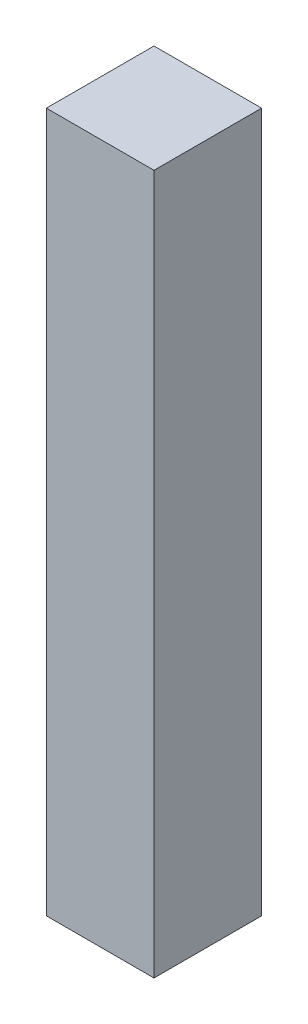
ISO-10303-21;
HEADER;
FILE_DESCRIPTION(('STEP AP214'),'2;1');
FILE_NAME('part.step','',(''),(''),'','','');
FILE_SCHEMA(('AUTOMOTIVE_DESIGN { 1 0 10303 214 1 1 1 1 }'));
ENDSEC;
DATA;
#1=APPLICATION_CONTEXT('core data for automotive mechanical design processes');
#2=APPLICATION_PROTOCOL_DEFINITION('international standard','automotive_design',2000,#1);
#3=PRODUCT_CONTEXT('',#1,'mechanical');
#4=PRODUCT('Part','Part','',(#3));
#5=PRODUCT_RELATED_PRODUCT_CATEGORY('part','',(#4));
#6=PRODUCT_DEFINITION_FORMATION('','',#4);
#7=PRODUCT_DEFINITION_CONTEXT('part definition',#1,'design');
#8=PRODUCT_DEFINITION('design','',#6,#7);
#9=PRODUCT_DEFINITION_SHAPE('','',#8);
#10=(LENGTH_UNIT() NAMED_UNIT(*) SI_UNIT(.MILLI.,.METRE.));
#11=(NAMED_UNIT(*) PLANE_ANGLE_UNIT() SI_UNIT($,.RADIAN.));
#12=(NAMED_UNIT(*) SI_UNIT($,.STERADIAN.) SOLID_ANGLE_UNIT());
#13=UNCERTAINTY_MEASURE_WITH_UNIT(LENGTH_MEASURE(1.E-05),#10,'distance_accuracy_value','');
#14=(GEOMETRIC_REPRESENTATION_CONTEXT(3) GLOBAL_UNCERTAINTY_ASSIGNED_CONTEXT((#13)) GLOBAL_UNIT_ASSIGNED_CONTEXT((#10,
#11,#12)) REPRESENTATION_CONTEXT('',''));
#15=CARTESIAN_POINT('',(0.,0.,0.));
#16=DIRECTION('',(0.,0.,1.));
#17=DIRECTION('',(1.,0.,0.));
#18=AXIS2_PLACEMENT_3D('',#15,#16,#17);
#19=CARTESIAN_POINT('',(2.5,16.25,2.5));
#20=DIRECTION('',(-1.,0.,0.));
#21=DIRECTION('',(0.,0.,1.));
#22=AXIS2_PLACEMENT_3D('',#19,#20,#21);
#23=PLANE('',#22);
#24=DIRECTION('',(0.,0.,-1.));
#25=VECTOR('',#24,1.);
#26=CARTESIAN_POINT('',(2.5,-16.25,2.5));
#27=LINE('',#26,#25);
#28=CARTESIAN_POINT('',(2.5,-16.25,2.5));
#29=VERTEX_POINT('',#28);
#30=CARTESIAN_POINT('',(2.5,-16.25,-2.5));
#31=VERTEX_POINT('',#30);
#32=EDGE_CURVE('E95',#29,#31,#27,.T.);
#33=ORIENTED_EDGE('',*,*,#32,.T.);
#34=DIRECTION('',(0.,-1.,0.));
#35=VECTOR('',#34,1.);
#36=CARTESIAN_POINT('',(2.5,16.25,-2.5));
#37=LINE('',#36,#35);
#38=CARTESIAN_POINT('',(2.5,16.25,-2.5));
#39=VERTEX_POINT('',#38);
#40=EDGE_CURVE('E11',#39,#31,#37,.T.);
#41=ORIENTED_EDGE('',*,*,#40,.F.);
#42=DIRECTION('',(0.,0.,-1.));
#43=VECTOR('',#42,1.);
#44=CARTESIAN_POINT('',(2.5,16.25,2.5));
#45=LINE('',#44,#43);
#46=CARTESIAN_POINT('',(2.5,16.25,2.5));
#47=VERTEX_POINT('',#46);
#48=EDGE_CURVE('E83',#47,#39,#45,.T.);
#49=ORIENTED_EDGE('',*,*,#48,.F.);
#50=DIRECTION('',(0.,-1.,0.));
#51=VECTOR('',#50,1.);
#52=CARTESIAN_POINT('',(2.5,16.25,2.5));
#53=LINE('',#52,#51);
#54=EDGE_CURVE('E91',#47,#29,#53,.T.);
#55=ORIENTED_EDGE('',*,*,#54,.T.);
#56=EDGE_LOOP('',(#33,#41,#49,#55));
#57=FACE_BOUND('',#56,.T.);
#58=ADVANCED_FACE('F32',(#57),#23,.F.);
#59=CARTESIAN_POINT('',(-2.5,16.25,-2.5));
#60=DIRECTION('',(0.,0.,1.));
#61=DIRECTION('',(1.,0.,0.));
#62=AXIS2_PLACEMENT_3D('',#59,#60,#61);
#63=PLANE('',#62);
#64=DIRECTION('',(-1.,0.,0.));
#65=VECTOR('',#64,1.);
#66=CARTESIAN_POINT('',(-2.5,-16.25,-2.5));
#67=LINE('',#66,#65);
#68=CARTESIAN_POINT('',(-2.5,-16.25,-2.5));
#69=VERTEX_POINT('',#68);
#70=EDGE_CURVE('E87',#31,#69,#67,.T.);
#71=ORIENTED_EDGE('',*,*,#70,.T.);
#72=DIRECTION('',(0.,-1.,0.));
#73=VECTOR('',#72,1.);
#74=CARTESIAN_POINT('',(-2.5,16.25,-2.5));
#75=LINE('',#74,#73);
#76=CARTESIAN_POINT('',(-2.5,16.25,-2.5));
#77=VERTEX_POINT('',#76);
#78=EDGE_CURVE('E40',#77,#69,#75,.T.);
#79=ORIENTED_EDGE('',*,*,#78,.F.);
#80=DIRECTION('',(-1.,0.,0.));
#81=VECTOR('',#80,1.);
#82=CARTESIAN_POINT('',(-2.5,16.25,-2.5));
#83=LINE('',#82,#81);
#84=EDGE_CURVE('E78',#39,#77,#83,.T.);
#85=ORIENTED_EDGE('',*,*,#84,.F.);
#86=ORIENTED_EDGE('',*,*,#40,.T.);
#87=EDGE_LOOP('',(#71,#79,#85,#86));
#88=FACE_BOUND('',#87,.T.);
#89=ADVANCED_FACE('F86',(#88),#63,.F.);
#90=CARTESIAN_POINT('',(-2.5,16.25,2.5));
#91=DIRECTION('',(1.,0.,0.));
#92=DIRECTION('',(0.,0.,-1.));
#93=AXIS2_PLACEMENT_3D('',#90,#91,#92);
#94=PLANE('',#93);
#95=DIRECTION('',(0.,0.,1.));
#96=VECTOR('',#95,1.);
#97=CARTESIAN_POINT('',(-2.5,-16.25,2.5));
#98=LINE('',#97,#96);
#99=CARTESIAN_POINT('',(-2.5,-16.25,2.5));
#100=VERTEX_POINT('',#99);
#101=EDGE_CURVE('E65',#69,#100,#98,.T.);
#102=ORIENTED_EDGE('',*,*,#101,.T.);
#103=DIRECTION('',(0.,-1.,0.));
#104=VECTOR('',#103,1.);
#105=CARTESIAN_POINT('',(-2.5,16.25,2.5));
#106=LINE('',#105,#104);
#107=CARTESIAN_POINT('',(-2.5,16.25,2.5));
#108=VERTEX_POINT('',#107);
#109=EDGE_CURVE('E88',#108,#100,#106,.T.);
#110=ORIENTED_EDGE('',*,*,#109,.F.);
#111=DIRECTION('',(0.,0.,1.));
#112=VECTOR('',#111,1.);
#113=CARTESIAN_POINT('',(-2.5,16.25,2.5));
#114=LINE('',#113,#112);
#115=EDGE_CURVE('E81',#77,#108,#114,.T.);
#116=ORIENTED_EDGE('',*,*,#115,.F.);
#117=ORIENTED_EDGE('',*,*,#78,.T.);
#118=EDGE_LOOP('',(#102,#110,#116,#117));
#119=FACE_BOUND('',#118,.T.);
#120=ADVANCED_FACE('F89',(#119),#94,.F.);
#121=CARTESIAN_POINT('',(-2.5,16.25,2.5));
#122=DIRECTION('',(0.,0.,-1.));
#123=DIRECTION('',(-1.,0.,0.));
#124=AXIS2_PLACEMENT_3D('',#121,#122,#123);
#125=PLANE('',#124);
#126=DIRECTION('',(1.,0.,0.));
#127=VECTOR('',#126,1.);
#128=CARTESIAN_POINT('',(-2.5,-16.25,2.5));
#129=LINE('',#128,#127);
#130=EDGE_CURVE('E71',#100,#29,#129,.T.);
#131=ORIENTED_EDGE('',*,*,#130,.T.);
#132=ORIENTED_EDGE('',*,*,#54,.F.);
#133=DIRECTION('',(1.,0.,0.));
#134=VECTOR('',#133,1.);
#135=CARTESIAN_POINT('',(-2.5,16.25,2.5));
#136=LINE('',#135,#134);
#137=EDGE_CURVE('E48',#108,#47,#136,.T.);
#138=ORIENTED_EDGE('',*,*,#137,.F.);
#139=ORIENTED_EDGE('',*,*,#109,.T.);
#140=EDGE_LOOP('',(#131,#132,#138,#139));
#141=FACE_BOUND('',#140,.T.);
#142=ADVANCED_FACE('F102',(#141),#125,.F.);
#143=CARTESIAN_POINT('',(0.,16.25,0.));
#144=DIRECTION('',(0.,-1.,0.));
#145=DIRECTION('',(0.,0.,-1.));
#146=AXIS2_PLACEMENT_3D('',#143,#144,#145);
#147=PLANE('',#146);
#148=ORIENTED_EDGE('',*,*,#48,.T.);
#149=ORIENTED_EDGE('',*,*,#84,.T.);
#150=ORIENTED_EDGE('',*,*,#115,.T.);
#151=ORIENTED_EDGE('',*,*,#137,.T.);
#152=EDGE_LOOP('',(#148,#149,#150,#151));
#153=FACE_BOUND('',#152,.T.);
#154=ADVANCED_FACE('F79',(#153),#147,.F.);
#155=CARTESIAN_POINT('',(0.,-16.25,0.));
#156=DIRECTION('',(0.,-1.,0.));
#157=DIRECTION('',(0.,0.,-1.));
#158=AXIS2_PLACEMENT_3D('',#155,#156,#157);
#159=PLANE('',#158);
#160=ORIENTED_EDGE('',*,*,#32,.F.);
#161=ORIENTED_EDGE('',*,*,#130,.F.);
#162=ORIENTED_EDGE('',*,*,#101,.F.);
#163=ORIENTED_EDGE('',*,*,#70,.F.);
#164=EDGE_LOOP('',(#160,#161,#162,#163));
#165=FACE_BOUND('',#164,.T.);
#166=ADVANCED_FACE('F105',(#165),#159,.T.);
#167=CLOSED_SHELL('',(#58,#89,#120,#142,#154,#166));
#168=MANIFOLD_SOLID_BREP('B2',#167);
#169=ADVANCED_BREP_SHAPE_REPRESENTATION('',(#18,#168),#14);
#170=SHAPE_DEFINITION_REPRESENTATION(#9,#169);
ENDSEC;
END-ISO-10303-21;
